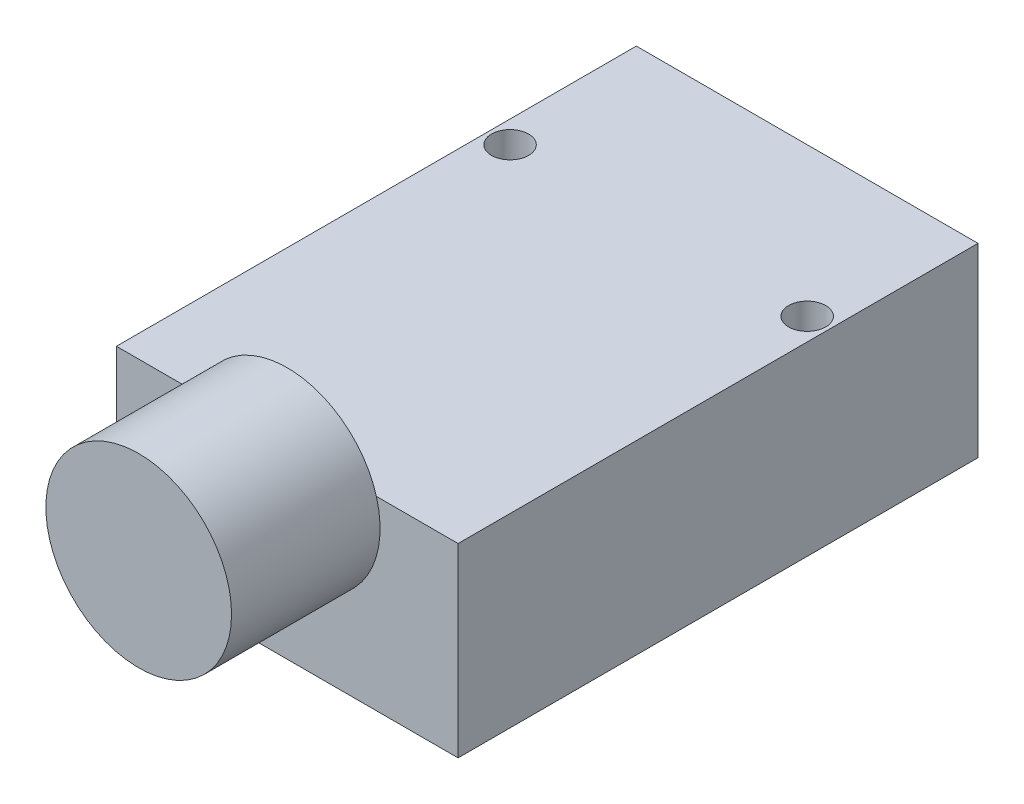
ISO-10303-21;
HEADER;
FILE_DESCRIPTION(('STEP AP214'),'2;1');
FILE_NAME('part.step','',(''),(''),'','','');
FILE_SCHEMA(('AUTOMOTIVE_DESIGN { 1 0 10303 214 1 1 1 1 }'));
ENDSEC;
DATA;
#1=APPLICATION_CONTEXT('core data for automotive mechanical design processes');
#2=APPLICATION_PROTOCOL_DEFINITION('international standard','automotive_design',2000,#1);
#3=PRODUCT_CONTEXT('',#1,'mechanical');
#4=PRODUCT('Part','Part','',(#3));
#5=PRODUCT_RELATED_PRODUCT_CATEGORY('part','',(#4));
#6=PRODUCT_DEFINITION_FORMATION('','',#4);
#7=PRODUCT_DEFINITION_CONTEXT('part definition',#1,'design');
#8=PRODUCT_DEFINITION('design','',#6,#7);
#9=PRODUCT_DEFINITION_SHAPE('','',#8);
#10=(LENGTH_UNIT() NAMED_UNIT(*) SI_UNIT(.MILLI.,.METRE.));
#11=(NAMED_UNIT(*) PLANE_ANGLE_UNIT() SI_UNIT($,.RADIAN.));
#12=(NAMED_UNIT(*) SI_UNIT($,.STERADIAN.) SOLID_ANGLE_UNIT());
#13=UNCERTAINTY_MEASURE_WITH_UNIT(LENGTH_MEASURE(1.E-05),#10,'distance_accuracy_value','');
#14=(GEOMETRIC_REPRESENTATION_CONTEXT(3) GLOBAL_UNCERTAINTY_ASSIGNED_CONTEXT((#13)) GLOBAL_UNIT_ASSIGNED_CONTEXT((#10,
#11,#12)) REPRESENTATION_CONTEXT('',''));
#15=CARTESIAN_POINT('',(0.,0.,0.));
#16=DIRECTION('',(0.,0.,1.));
#17=DIRECTION('',(1.,0.,0.));
#18=AXIS2_PLACEMENT_3D('',#15,#16,#17);
#19=CARTESIAN_POINT('',(0.,25.,0.));
#20=DIRECTION('',(1.,0.,0.));
#21=DIRECTION('',(0.,0.,-1.));
#22=AXIS2_PLACEMENT_3D('',#19,#20,#21);
#23=PLANE('',#22);
#24=DIRECTION('',(0.,0.,1.));
#25=VECTOR('',#24,1.);
#26=CARTESIAN_POINT('',(0.,0.,0.));
#27=LINE('',#26,#25);
#28=CARTESIAN_POINT('',(0.,0.,-70.));
#29=VERTEX_POINT('',#28);
#30=CARTESIAN_POINT('',(0.,0.,0.));
#31=VERTEX_POINT('',#30);
#32=EDGE_CURVE('E117',#29,#31,#27,.T.);
#33=ORIENTED_EDGE('',*,*,#32,.T.);
#34=DIRECTION('',(0.,-1.,0.));
#35=VECTOR('',#34,1.);
#36=CARTESIAN_POINT('',(0.,25.,0.));
#37=LINE('',#36,#35);
#38=CARTESIAN_POINT('',(0.,25.,0.));
#39=VERTEX_POINT('',#38);
#40=EDGE_CURVE('E42',#39,#31,#37,.T.);
#41=ORIENTED_EDGE('',*,*,#40,.F.);
#42=DIRECTION('',(0.,0.,1.));
#43=VECTOR('',#42,1.);
#44=CARTESIAN_POINT('',(0.,25.,0.));
#45=LINE('',#44,#43);
#46=CARTESIAN_POINT('',(0.,25.,-70.));
#47=VERTEX_POINT('',#46);
#48=EDGE_CURVE('E107',#47,#39,#45,.T.);
#49=ORIENTED_EDGE('',*,*,#48,.F.);
#50=DIRECTION('',(0.,-1.,0.));
#51=VECTOR('',#50,1.);
#52=CARTESIAN_POINT('',(0.,25.,-70.));
#53=LINE('',#52,#51);
#54=EDGE_CURVE('E132',#47,#29,#53,.T.);
#55=ORIENTED_EDGE('',*,*,#54,.T.);
#56=EDGE_LOOP('',(#33,#41,#49,#55));
#57=FACE_BOUND('',#56,.T.);
#58=ADVANCED_FACE('F39',(#57),#23,.F.);
#59=CARTESIAN_POINT('',(0.,25.,0.));
#60=DIRECTION('',(0.,0.,-1.));
#61=DIRECTION('',(-1.,0.,0.));
#62=AXIS2_PLACEMENT_3D('',#59,#60,#61);
#63=PLANE('',#62);
#64=CARTESIAN_POINT('',(23.,21.5,0.));
#65=DIRECTION('',(0.,0.,1.));
#66=DIRECTION('',(1.,0.,0.));
#67=AXIS2_PLACEMENT_3D('',#64,#65,#66);
#68=CIRCLE('',#67,12.5);
#69=CARTESIAN_POINT('',(11.,25.,0.));
#70=VERTEX_POINT('',#69);
#71=CARTESIAN_POINT('',(35.,25.,0.));
#72=VERTEX_POINT('',#71);
#73=EDGE_CURVE('E11',#70,#72,#68,.T.);
#74=ORIENTED_EDGE('',*,*,#73,.F.);
#75=DIRECTION('',(1.,0.,0.));
#76=VECTOR('',#75,1.);
#77=CARTESIAN_POINT('',(0.,25.,0.));
#78=LINE('',#77,#76);
#79=EDGE_CURVE('E88',#39,#70,#78,.T.);
#80=ORIENTED_EDGE('',*,*,#79,.F.);
#81=ORIENTED_EDGE('',*,*,#40,.T.);
#82=DIRECTION('',(1.,0.,0.));
#83=VECTOR('',#82,1.);
#84=CARTESIAN_POINT('',(0.,0.,0.));
#85=LINE('',#84,#83);
#86=CARTESIAN_POINT('',(46.,0.,0.));
#87=VERTEX_POINT('',#86);
#88=EDGE_CURVE('E136',#31,#87,#85,.T.);
#89=ORIENTED_EDGE('',*,*,#88,.T.);
#90=DIRECTION('',(0.,-1.,0.));
#91=VECTOR('',#90,1.);
#92=CARTESIAN_POINT('',(46.,25.,0.));
#93=LINE('',#92,#91);
#94=CARTESIAN_POINT('',(46.,25.,0.));
#95=VERTEX_POINT('',#94);
#96=EDGE_CURVE('E104',#95,#87,#93,.T.);
#97=ORIENTED_EDGE('',*,*,#96,.F.);
#98=EDGE_CURVE('E95',#72,#95,#78,.T.);
#99=ORIENTED_EDGE('',*,*,#98,.F.);
#100=EDGE_LOOP('',(#74,#80,#81,#89,#97,#99));
#101=FACE_BOUND('',#100,.T.);
#102=ADVANCED_FACE('F102',(#101),#63,.F.);
#103=CARTESIAN_POINT('',(46.,25.,0.));
#104=DIRECTION('',(-1.,0.,0.));
#105=DIRECTION('',(0.,0.,1.));
#106=AXIS2_PLACEMENT_3D('',#103,#104,#105);
#107=PLANE('',#106);
#108=DIRECTION('',(0.,0.,-1.));
#109=VECTOR('',#108,1.);
#110=CARTESIAN_POINT('',(46.,0.,0.));
#111=LINE('',#110,#109);
#112=CARTESIAN_POINT('',(46.,0.,-70.));
#113=VERTEX_POINT('',#112);
#114=EDGE_CURVE('E139',#87,#113,#111,.T.);
#115=ORIENTED_EDGE('',*,*,#114,.T.);
#116=DIRECTION('',(0.,-1.,0.));
#117=VECTOR('',#116,1.);
#118=CARTESIAN_POINT('',(46.,25.,-70.));
#119=LINE('',#118,#117);
#120=CARTESIAN_POINT('',(46.,25.,-70.));
#121=VERTEX_POINT('',#120);
#122=EDGE_CURVE('E146',#121,#113,#119,.T.);
#123=ORIENTED_EDGE('',*,*,#122,.F.);
#124=DIRECTION('',(0.,0.,-1.));
#125=VECTOR('',#124,1.);
#126=CARTESIAN_POINT('',(46.,25.,0.));
#127=LINE('',#126,#125);
#128=EDGE_CURVE('E127',#95,#121,#127,.T.);
#129=ORIENTED_EDGE('',*,*,#128,.F.);
#130=ORIENTED_EDGE('',*,*,#96,.T.);
#131=EDGE_LOOP('',(#115,#123,#129,#130));
#132=FACE_BOUND('',#131,.T.);
#133=ADVANCED_FACE('F159',(#132),#107,.F.);
#134=CARTESIAN_POINT('',(0.,25.,-70.));
#135=DIRECTION('',(0.,0.,1.));
#136=DIRECTION('',(1.,0.,0.));
#137=AXIS2_PLACEMENT_3D('',#134,#135,#136);
#138=PLANE('',#137);
#139=DIRECTION('',(-1.,0.,0.));
#140=VECTOR('',#139,1.);
#141=CARTESIAN_POINT('',(0.,0.,-70.));
#142=LINE('',#141,#140);
#143=EDGE_CURVE('E84',#113,#29,#142,.T.);
#144=ORIENTED_EDGE('',*,*,#143,.T.);
#145=ORIENTED_EDGE('',*,*,#54,.F.);
#146=DIRECTION('',(-1.,0.,0.));
#147=VECTOR('',#146,1.);
#148=CARTESIAN_POINT('',(0.,25.,-70.));
#149=LINE('',#148,#147);
#150=EDGE_CURVE('E63',#121,#47,#149,.T.);
#151=ORIENTED_EDGE('',*,*,#150,.F.);
#152=ORIENTED_EDGE('',*,*,#122,.T.);
#153=EDGE_LOOP('',(#144,#145,#151,#152));
#154=FACE_BOUND('',#153,.T.);
#155=ADVANCED_FACE('F160',(#154),#138,.F.);
#156=CARTESIAN_POINT('',(0.,25.,0.));
#157=DIRECTION('',(0.,-1.,0.));
#158=DIRECTION('',(0.,0.,-1.));
#159=AXIS2_PLACEMENT_3D('',#156,#157,#158);
#160=PLANE('',#159);
#161=CARTESIAN_POINT('',(3.,25.,-50.));
#162=DIRECTION('',(0.,1.,0.));
#163=DIRECTION('',(0.,0.,1.));
#164=AXIS2_PLACEMENT_3D('',#161,#162,#163);
#165=CIRCLE('',#164,2.5);
#166=CARTESIAN_POINT('',(3.,25.,-47.5));
#167=VERTEX_POINT('',#166);
#168=EDGE_CURVE('E113',#167,#167,#165,.T.);
#169=ORIENTED_EDGE('',*,*,#168,.F.);
#170=EDGE_LOOP('',(#169));
#171=FACE_BOUND('',#170,.T.);
#172=CARTESIAN_POINT('',(43.,25.,-50.));
#173=DIRECTION('',(0.,1.,0.));
#174=DIRECTION('',(0.,0.,1.));
#175=AXIS2_PLACEMENT_3D('',#172,#173,#174);
#176=CIRCLE('',#175,2.5);
#177=CARTESIAN_POINT('',(43.,25.,-47.5));
#178=VERTEX_POINT('',#177);
#179=EDGE_CURVE('E259',#178,#178,#176,.T.);
#180=ORIENTED_EDGE('',*,*,#179,.F.);
#181=EDGE_LOOP('',(#180));
#182=FACE_BOUND('',#181,.T.);
#183=ORIENTED_EDGE('',*,*,#48,.T.);
#184=ORIENTED_EDGE('',*,*,#79,.T.);
#185=EDGE_CURVE('E93',#70,#72,#78,.T.);
#186=ORIENTED_EDGE('',*,*,#185,.T.);
#187=ORIENTED_EDGE('',*,*,#98,.T.);
#188=ORIENTED_EDGE('',*,*,#128,.T.);
#189=ORIENTED_EDGE('',*,*,#150,.T.);
#190=EDGE_LOOP('',(#183,#184,#186,#187,#188,#189));
#191=FACE_BOUND('',#190,.T.);
#192=ADVANCED_FACE('F94',(#171,#182,#191),#160,.F.);
#193=CARTESIAN_POINT('',(0.,0.,0.));
#194=DIRECTION('',(0.,-1.,0.));
#195=DIRECTION('',(0.,0.,-1.));
#196=AXIS2_PLACEMENT_3D('',#193,#194,#195);
#197=PLANE('',#196);
#198=CARTESIAN_POINT('',(3.,0.,-50.));
#199=DIRECTION('',(0.,-1.,0.));
#200=DIRECTION('',(0.,0.,-1.));
#201=AXIS2_PLACEMENT_3D('',#198,#199,#200);
#202=CIRCLE('',#201,2.5);
#203=CARTESIAN_POINT('',(3.,0.,-52.5));
#204=VERTEX_POINT('',#203);
#205=EDGE_CURVE('E120',#204,#204,#202,.F.);
#206=ORIENTED_EDGE('',*,*,#205,.T.);
#207=EDGE_LOOP('',(#206));
#208=FACE_BOUND('',#207,.T.);
#209=CARTESIAN_POINT('',(43.,0.,-50.));
#210=DIRECTION('',(0.,-1.,0.));
#211=DIRECTION('',(0.,0.,-1.));
#212=AXIS2_PLACEMENT_3D('',#209,#210,#211);
#213=CIRCLE('',#212,2.5);
#214=CARTESIAN_POINT('',(43.,0.,-52.5));
#215=VERTEX_POINT('',#214);
#216=EDGE_CURVE('E262',#215,#215,#213,.F.);
#217=ORIENTED_EDGE('',*,*,#216,.T.);
#218=EDGE_LOOP('',(#217));
#219=FACE_BOUND('',#218,.T.);
#220=ORIENTED_EDGE('',*,*,#32,.F.);
#221=ORIENTED_EDGE('',*,*,#143,.F.);
#222=ORIENTED_EDGE('',*,*,#114,.F.);
#223=ORIENTED_EDGE('',*,*,#88,.F.);
#224=EDGE_LOOP('',(#220,#221,#222,#223));
#225=FACE_BOUND('',#224,.T.);
#226=ADVANCED_FACE('F157',(#208,#219,#225),#197,.T.);
#227=CARTESIAN_POINT('',(23.,21.5,20.));
#228=DIRECTION('',(0.,0.,-1.));
#229=DIRECTION('',(-1.,0.,0.));
#230=AXIS2_PLACEMENT_3D('',#227,#228,#229);
#231=CYLINDRICAL_SURFACE('',#230,12.5);
#232=CARTESIAN_POINT('',(23.,21.5,20.));
#233=DIRECTION('',(0.,0.,1.));
#234=DIRECTION('',(1.,0.,0.));
#235=AXIS2_PLACEMENT_3D('',#232,#233,#234);
#236=CIRCLE('',#235,12.5);
#237=CARTESIAN_POINT('',(35.5,21.5,20.));
#238=VERTEX_POINT('',#237);
#239=EDGE_CURVE('E112',#238,#238,#236,.T.);
#240=ORIENTED_EDGE('',*,*,#239,.F.);
#241=EDGE_LOOP('',(#240));
#242=FACE_BOUND('',#241,.T.);
#243=EDGE_CURVE('E49',#72,#70,#68,.T.);
#244=ORIENTED_EDGE('',*,*,#243,.T.);
#245=ORIENTED_EDGE('',*,*,#73,.T.);
#246=EDGE_LOOP('',(#244,#245));
#247=FACE_BOUND('',#246,.T.);
#248=ADVANCED_FACE('F109',(#242,#247),#231,.T.);
#249=CARTESIAN_POINT('',(23.,21.5,20.));
#250=DIRECTION('',(0.,0.,1.));
#251=DIRECTION('',(1.,0.,0.));
#252=AXIS2_PLACEMENT_3D('',#249,#250,#251);
#253=PLANE('',#252);
#254=ORIENTED_EDGE('',*,*,#239,.T.);
#255=EDGE_LOOP('',(#254));
#256=FACE_BOUND('',#255,.T.);
#257=ADVANCED_FACE('F211',(#256),#253,.T.);
#258=CARTESIAN_POINT('',(23.,21.5,0.));
#259=DIRECTION('',(0.,0.,1.));
#260=DIRECTION('',(1.,0.,0.));
#261=AXIS2_PLACEMENT_3D('',#258,#259,#260);
#262=PLANE('',#261);
#263=ORIENTED_EDGE('',*,*,#185,.F.);
#264=ORIENTED_EDGE('',*,*,#243,.F.);
#265=EDGE_LOOP('',(#263,#264));
#266=FACE_BOUND('',#265,.T.);
#267=ADVANCED_FACE('F110',(#266),#262,.F.);
#268=CARTESIAN_POINT('',(43.,-0.001000000000001,-50.));
#269=DIRECTION('',(0.,1.,0.));
#270=DIRECTION('',(0.,0.,1.));
#271=AXIS2_PLACEMENT_3D('',#268,#269,#270);
#272=CYLINDRICAL_SURFACE('',#271,2.5);
#273=ORIENTED_EDGE('',*,*,#216,.F.);
#274=EDGE_LOOP('',(#273));
#275=FACE_BOUND('',#274,.T.);
#276=ORIENTED_EDGE('',*,*,#179,.T.);
#277=EDGE_LOOP('',(#276));
#278=FACE_BOUND('',#277,.T.);
#279=ADVANCED_FACE('F227',(#275,#278),#272,.F.);
#280=CARTESIAN_POINT('',(3.,-0.001000000000001,-50.));
#281=DIRECTION('',(0.,1.,0.));
#282=DIRECTION('',(0.,0.,1.));
#283=AXIS2_PLACEMENT_3D('',#280,#281,#282);
#284=CYLINDRICAL_SURFACE('',#283,2.5);
#285=ORIENTED_EDGE('',*,*,#205,.F.);
#286=EDGE_LOOP('',(#285));
#287=FACE_BOUND('',#286,.T.);
#288=ORIENTED_EDGE('',*,*,#168,.T.);
#289=EDGE_LOOP('',(#288));
#290=FACE_BOUND('',#289,.T.);
#291=ADVANCED_FACE('F234',(#287,#290),#284,.F.);
#292=CLOSED_SHELL('',(#58,#102,#133,#155,#192,#226,#248,#257,#267,#279,#291));
#293=MANIFOLD_SOLID_BREP('B2',#292);
#294=ADVANCED_BREP_SHAPE_REPRESENTATION('',(#18,#293),#14);
#295=SHAPE_DEFINITION_REPRESENTATION(#9,#294);
ENDSEC;
END-ISO-10303-21;
